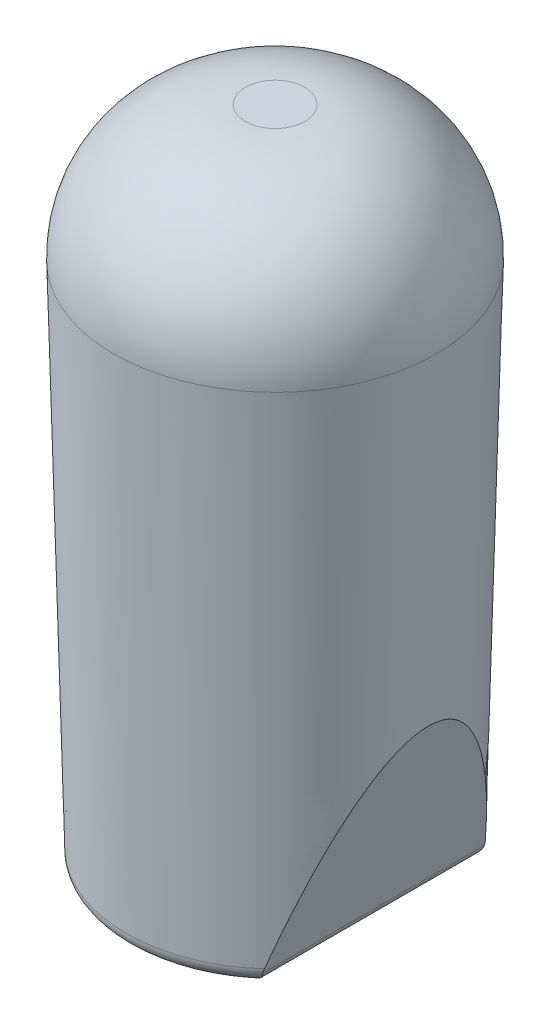
ISO-10303-21;
HEADER;
FILE_DESCRIPTION(('STEP AP214'),'2;1');
FILE_NAME('part.step','',(''),(''),'','','');
FILE_SCHEMA(('AUTOMOTIVE_DESIGN { 1 0 10303 214 1 1 1 1 }'));
ENDSEC;
DATA;
#1=APPLICATION_CONTEXT('core data for automotive mechanical design processes');
#2=APPLICATION_PROTOCOL_DEFINITION('international standard','automotive_design',2000,#1);
#3=PRODUCT_CONTEXT('',#1,'mechanical');
#4=PRODUCT('Part','Part','',(#3));
#5=PRODUCT_RELATED_PRODUCT_CATEGORY('part','',(#4));
#6=PRODUCT_DEFINITION_FORMATION('','',#4);
#7=PRODUCT_DEFINITION_CONTEXT('part definition',#1,'design');
#8=PRODUCT_DEFINITION('design','',#6,#7);
#9=PRODUCT_DEFINITION_SHAPE('','',#8);
#10=(LENGTH_UNIT() NAMED_UNIT(*) SI_UNIT(.MILLI.,.METRE.));
#11=(NAMED_UNIT(*) PLANE_ANGLE_UNIT() SI_UNIT($,.RADIAN.));
#12=(NAMED_UNIT(*) SI_UNIT($,.STERADIAN.) SOLID_ANGLE_UNIT());
#13=UNCERTAINTY_MEASURE_WITH_UNIT(LENGTH_MEASURE(1.E-05),#10,'distance_accuracy_value','');
#14=(GEOMETRIC_REPRESENTATION_CONTEXT(3) GLOBAL_UNCERTAINTY_ASSIGNED_CONTEXT((#13)) GLOBAL_UNIT_ASSIGNED_CONTEXT((#10,
#11,#12)) REPRESENTATION_CONTEXT('',''));
#15=CARTESIAN_POINT('',(0.,0.,0.));
#16=DIRECTION('',(0.,0.,1.));
#17=DIRECTION('',(1.,0.,0.));
#18=AXIS2_PLACEMENT_3D('',#15,#16,#17);
#19=CARTESIAN_POINT('',(9.,0.,0.));
#20=DIRECTION('',(0.,-1.,0.));
#21=DIRECTION('',(0.,0.,1.));
#22=AXIS2_PLACEMENT_3D('',#19,#20,#21);
#23=PLANE('',#22);
#24=DIRECTION('',(0.,0.,1.));
#25=VECTOR('',#24,1.);
#26=CARTESIAN_POINT('',(-2.38,0.,-7.));
#27=LINE('',#26,#25);
#28=CARTESIAN_POINT('',(-2.38,0.,-7.));
#29=VERTEX_POINT('',#28);
#30=CARTESIAN_POINT('',(-2.38,0.,7.));
#31=VERTEX_POINT('',#30);
#32=EDGE_CURVE('E147',#29,#31,#27,.T.);
#33=ORIENTED_EDGE('',*,*,#32,.T.);
#34=DIRECTION('',(1.,0.,0.));
#35=VECTOR('',#34,1.);
#36=CARTESIAN_POINT('',(2.38,0.,7.));
#37=LINE('',#36,#35);
#38=CARTESIAN_POINT('',(2.38,0.,7.));
#39=VERTEX_POINT('',#38);
#40=EDGE_CURVE('E132',#31,#39,#37,.T.);
#41=ORIENTED_EDGE('',*,*,#40,.T.);
#42=DIRECTION('',(0.,0.,-1.));
#43=VECTOR('',#42,1.);
#44=CARTESIAN_POINT('',(2.38,0.,-7.));
#45=LINE('',#44,#43);
#46=CARTESIAN_POINT('',(2.38,0.,-7.));
#47=VERTEX_POINT('',#46);
#48=EDGE_CURVE('E142',#39,#47,#45,.T.);
#49=ORIENTED_EDGE('',*,*,#48,.T.);
#50=DIRECTION('',(-1.,0.,0.));
#51=VECTOR('',#50,1.);
#52=CARTESIAN_POINT('',(2.38,0.,-7.));
#53=LINE('',#52,#51);
#54=EDGE_CURVE('E139',#47,#29,#53,.T.);
#55=ORIENTED_EDGE('',*,*,#54,.T.);
#56=EDGE_LOOP('',(#33,#41,#49,#55));
#57=FACE_BOUND('',#56,.T.);
#58=DIRECTION('',(0.,0.,-1.));
#59=VECTOR('',#58,1.);
#60=CARTESIAN_POINT('',(-5.01324340538408,0.,0.));
#61=LINE('',#60,#59);
#62=CARTESIAN_POINT('',(-5.01324340538407,0.,-6.26601953511522));
#63=VERTEX_POINT('',#62);
#64=CARTESIAN_POINT('',(-5.01324340538408,0.,6.26601953511523));
#65=VERTEX_POINT('',#64);
#66=EDGE_CURVE('E172',#63,#65,#61,.F.);
#67=ORIENTED_EDGE('',*,*,#66,.F.);
#68=CARTESIAN_POINT('',(0.,0.,0.));
#69=DIRECTION('',(0.,1.,0.));
#70=DIRECTION('',(0.,0.,1.));
#71=AXIS2_PLACEMENT_3D('',#68,#69,#70);
#72=CIRCLE('',#71,8.02468754881287);
#73=CARTESIAN_POINT('',(5.01324340538407,0.,-6.26601953511522));
#74=VERTEX_POINT('',#73);
#75=EDGE_CURVE('E169',#74,#63,#72,.T.);
#76=ORIENTED_EDGE('',*,*,#75,.F.);
#77=DIRECTION('',(0.,0.,-1.));
#78=VECTOR('',#77,1.);
#79=CARTESIAN_POINT('',(5.01324340538408,0.,-6.91462258432967));
#80=LINE('',#79,#78);
#81=CARTESIAN_POINT('',(5.01324340538408,0.,6.26601953511523));
#82=VERTEX_POINT('',#81);
#83=EDGE_CURVE('E174',#82,#74,#80,.T.);
#84=ORIENTED_EDGE('',*,*,#83,.F.);
#85=CARTESIAN_POINT('',(0.,0.,0.));
#86=DIRECTION('',(0.,1.,0.));
#87=DIRECTION('',(0.,0.,1.));
#88=AXIS2_PLACEMENT_3D('',#85,#86,#87);
#89=CIRCLE('',#88,8.02468754881287);
#90=EDGE_CURVE('E177',#65,#82,#89,.T.);
#91=ORIENTED_EDGE('',*,*,#90,.F.);
#92=EDGE_LOOP('',(#67,#76,#84,#91));
#93=FACE_BOUND('',#92,.T.);
#94=ADVANCED_FACE('F35',(#57,#93),#23,.T.);
#95=CARTESIAN_POINT('',(0.,0.,0.));
#96=DIRECTION('',(0.,1.,0.));
#97=DIRECTION('',(0.,0.,-1.));
#98=AXIS2_PLACEMENT_3D('',#95,#96,#97);
#99=CONICAL_SURFACE('',#98,9.,0.0249947936189201);
#100=CARTESIAN_POINT('',(0.72673325034867,-17.0693300139473,0.));
#101=DIRECTION('',(0.959155660836636,-0.282878804941331,0.));
#102=DIRECTION('',(0.282878804941331,0.959155660836636,0.));
#103=AXIS2_PLACEMENT_3D('',#100,#101,#102);
#104=ELLIPSE('',#103,30.3072078921905,8.54240958649927);
#105=CARTESIAN_POINT('',(6.04845622784257,0.975007808839801,6.69742673897912));
#106=VERTEX_POINT('',#105);
#107=CARTESIAN_POINT('',(6.04845622784257,0.975007808839783,-6.69742673897912));
#108=VERTEX_POINT('',#107);
#109=EDGE_CURVE('E166',#106,#108,#104,.F.);
#110=ORIENTED_EDGE('',*,*,#109,.T.);
#111=CARTESIAN_POINT('',(0.,0.975007808839801,0.));
#112=DIRECTION('',(0.,1.,0.));
#113=DIRECTION('',(0.,0.,1.));
#114=AXIS2_PLACEMENT_3D('',#111,#112,#113);
#115=CIRCLE('',#114,9.024375195221);
#116=CARTESIAN_POINT('',(-6.04845622784257,0.975007808839801,-6.69742673897911));
#117=VERTEX_POINT('',#116);
#118=EDGE_CURVE('E49',#117,#108,#115,.F.);
#119=ORIENTED_EDGE('',*,*,#118,.F.);
#120=CARTESIAN_POINT('',(-0.726733250348684,-17.0693300139473,0.));
#121=DIRECTION('',(0.959155660836636,0.282878804941331,0.));
#122=DIRECTION('',(-0.282878804941331,0.959155660836636,0.));
#123=AXIS2_PLACEMENT_3D('',#120,#121,#122);
#124=ELLIPSE('',#123,30.3072078921905,8.54240958649926);
#125=CARTESIAN_POINT('',(-6.04845622784257,0.975007808839797,6.69742673897911));
#126=VERTEX_POINT('',#125);
#127=EDGE_CURVE('E163',#126,#117,#124,.F.);
#128=ORIENTED_EDGE('',*,*,#127,.F.);
#129=CARTESIAN_POINT('',(0.,0.975007808839801,0.));
#130=DIRECTION('',(0.,1.,0.));
#131=DIRECTION('',(0.,0.,1.));
#132=AXIS2_PLACEMENT_3D('',#129,#130,#131);
#133=CIRCLE('',#132,9.024375195221);
#134=EDGE_CURVE('E11',#106,#126,#133,.F.);
#135=ORIENTED_EDGE('',*,*,#134,.F.);
#136=EDGE_LOOP('',(#110,#119,#128,#135));
#137=FACE_BOUND('',#136,.T.);
#138=CARTESIAN_POINT('',(0.,31.8000624707184,0.));
#139=DIRECTION('',(0.,1.,0.));
#140=DIRECTION('',(0.,0.,1.));
#141=AXIS2_PLACEMENT_3D('',#138,#139,#140);
#142=CIRCLE('',#141,9.79500156176796);
#143=CARTESIAN_POINT('',(0.,31.8000624707184,9.79500156176796));
#144=VERTEX_POINT('',#143);
#145=EDGE_CURVE('E157',#144,#144,#142,.T.);
#146=ORIENTED_EDGE('',*,*,#145,.F.);
#147=EDGE_LOOP('',(#146));
#148=FACE_BOUND('',#147,.T.);
#149=ADVANCED_FACE('F248',(#137,#148),#99,.T.);
#150=CARTESIAN_POINT('',(0.,40.,0.));
#151=DIRECTION('',(0.,1.,0.));
#152=DIRECTION('',(0.,0.,-1.));
#153=AXIS2_PLACEMENT_3D('',#150,#151,#152);
#154=PLANE('',#153);
#155=CARTESIAN_POINT('',(0.,40.,0.));
#156=DIRECTION('',(0.,-1.,0.));
#157=DIRECTION('',(0.,0.,-1.));
#158=AXIS2_PLACEMENT_3D('',#155,#156,#157);
#159=CIRCLE('',#158,1.79750039050298);
#160=CARTESIAN_POINT('',(0.,40.,-1.79750039050298));
#161=VERTEX_POINT('',#160);
#162=EDGE_CURVE('E160',#161,#161,#159,.T.);
#163=ORIENTED_EDGE('',*,*,#162,.F.);
#164=EDGE_LOOP('',(#163));
#165=FACE_BOUND('',#164,.T.);
#166=ADVANCED_FACE('F283',(#165),#154,.T.);
#167=CARTESIAN_POINT('',(0.,32.,0.));
#168=DIRECTION('',(0.,1.,0.));
#169=DIRECTION('',(0.,0.,-1.));
#170=AXIS2_PLACEMENT_3D('',#167,#168,#169);
#171=DEGENERATE_TOROIDAL_SURFACE('',#170,1.79750039050298,8.,.T.);
#172=ORIENTED_EDGE('',*,*,#162,.T.);
#173=EDGE_LOOP('',(#172));
#174=FACE_BOUND('',#173,.T.);
#175=ORIENTED_EDGE('',*,*,#145,.T.);
#176=EDGE_LOOP('',(#175));
#177=FACE_BOUND('',#176,.T.);
#178=ADVANCED_FACE('F261',(#174,#177),#171,.T.);
#179=CARTESIAN_POINT('',(-9.3,12.,72.0767019800829));
#180=DIRECTION('',(-0.959155660836636,-0.282878804941331,0.));
#181=DIRECTION('',(0.282878804941331,-0.959155660836636,0.));
#182=AXIS2_PLACEMENT_3D('',#179,#180,#181);
#183=PLANE('',#182);
#184=ORIENTED_EDGE('',*,*,#127,.T.);
#185=CARTESIAN_POINT('',(-5.97239906622071,0.71712119505867,-6.71117636553917));
#186=CARTESIAN_POINT('',(-5.97875164745178,0.73866085848437,-6.71403238115715));
#187=CARTESIAN_POINT('',(-5.98514013425925,0.760322266757219,-6.71583606493878));
#188=CARTESIAN_POINT('',(-5.99788974646451,0.803552309116433,-6.71739895712802));
#189=CARTESIAN_POINT('',(-6.00425072149561,0.825120433355341,-6.71717328582126));
#190=CARTESIAN_POINT('',(-6.01694133906215,0.868150442906553,-6.71477828334975));
#191=CARTESIAN_POINT('',(-6.02327098596146,0.889612343015406,-6.71260923101547));
#192=CARTESIAN_POINT('',(-6.03590546793278,0.932452013902179,-6.70640596599612));
#193=CARTESIAN_POINT('',(-6.04220976078654,0.953827946183526,-6.70235788528758));
#194=CARTESIAN_POINT('',(-6.0484562278426,0.9750078088399,-6.69742673897909));
#195=B_SPLINE_CURVE_WITH_KNOTS('',3,(#185,#186,#187,#188,#189,#190,#191,#192,#193,#194),
.UNSPECIFIED.,.F.,.F.,(4,2,2,2,4),(0.,0.0678790607278224,0.135252790744318,0.202616855727603,
0.270486200087882),.UNSPECIFIED.);
#196=CARTESIAN_POINT('',(-5.97239906622071,0.71712119505867,-6.71117636553917));
#197=VERTEX_POINT('',#196);
#198=EDGE_CURVE('E239',#197,#117,#195,.T.);
#199=ORIENTED_EDGE('',*,*,#198,.F.);
#200=DIRECTION('',(0.,0.,-1.));
#201=VECTOR('',#200,1.);
#202=CARTESIAN_POINT('',(-5.97239906622071,0.71712119505867,72.0767019800829));
#203=LINE('',#202,#201);
#204=CARTESIAN_POINT('',(-5.97239906622071,0.71712119505867,6.71117636553917));
#205=VERTEX_POINT('',#204);
#206=EDGE_CURVE('E237',#205,#197,#203,.T.);
#207=ORIENTED_EDGE('',*,*,#206,.F.);
#208=CARTESIAN_POINT('',(-6.04845622784257,0.975007808839797,6.69742673897911));
#209=CARTESIAN_POINT('',(-6.04220976078651,0.953827946183432,6.70235788528759));
#210=CARTESIAN_POINT('',(-6.03590546793275,0.932452013902093,6.70640596599613));
#211=CARTESIAN_POINT('',(-6.02327098596144,0.889612343015337,6.71260923101548));
#212=CARTESIAN_POINT('',(-6.01694133906214,0.868150442906492,6.71477828334975));
#213=CARTESIAN_POINT('',(-6.0042507214956,0.825120433355298,6.71717328582127));
#214=CARTESIAN_POINT('',(-5.99788974646449,0.803552309116398,6.71739895712802));
#215=CARTESIAN_POINT('',(-5.98514013425925,0.760322266757202,6.71583606493878));
#216=CARTESIAN_POINT('',(-5.97875164745178,0.738660858484362,6.71403238115715));
#217=CARTESIAN_POINT('',(-5.97239906622071,0.717121195058671,6.71117636553917));
#218=B_SPLINE_CURVE_WITH_KNOTS('',3,(#208,#209,#210,#211,#212,#213,#214,#215,#216,#217),
.UNSPECIFIED.,.F.,.F.,(4,2,2,2,4),(0.,0.0678693443602504,0.135233409343509,0.202607139359977,
0.270486200087772),.UNSPECIFIED.);
#219=EDGE_CURVE('E245',#126,#205,#218,.T.);
#220=ORIENTED_EDGE('',*,*,#219,.F.);
#221=EDGE_LOOP('',(#184,#199,#207,#220));
#222=FACE_BOUND('',#221,.T.);
#223=ADVANCED_FACE('F244',(#222),#183,.T.);
#224=CARTESIAN_POINT('',(9.3,12.,69.469980210495));
#225=DIRECTION('',(-0.959155660836636,0.282878804941331,0.));
#226=DIRECTION('',(-0.282878804941331,-0.959155660836636,0.));
#227=AXIS2_PLACEMENT_3D('',#224,#225,#226);
#228=PLANE('',#227);
#229=DIRECTION('',(0.,0.,-1.));
#230=VECTOR('',#229,1.);
#231=CARTESIAN_POINT('',(5.97239906622071,0.717121195058669,6.91462258432967));
#232=LINE('',#231,#230);
#233=CARTESIAN_POINT('',(5.97239906622071,0.717121195058669,-6.71117636553917));
#234=VERTEX_POINT('',#233);
#235=CARTESIAN_POINT('',(5.97239906622071,0.717121195058669,6.71117636553917));
#236=VERTEX_POINT('',#235);
#237=EDGE_CURVE('E189',#234,#236,#232,.F.);
#238=ORIENTED_EDGE('',*,*,#237,.F.);
#239=CARTESIAN_POINT('',(6.04845622784257,0.975007808839797,-6.69742673897911));
#240=CARTESIAN_POINT('',(6.04220976078651,0.953827946183431,-6.7023578852876));
#241=CARTESIAN_POINT('',(6.03590546793275,0.932452013902092,-6.70640596599614));
#242=CARTESIAN_POINT('',(6.02327098596144,0.889612343015336,-6.71260923101548));
#243=CARTESIAN_POINT('',(6.01694133906214,0.868150442906491,-6.71477828334975));
#244=CARTESIAN_POINT('',(6.0042507214956,0.825120433355296,-6.71717328582127));
#245=CARTESIAN_POINT('',(5.99788974646449,0.803552309116396,-6.71739895712802));
#246=CARTESIAN_POINT('',(5.98514013425925,0.760322266757201,-6.71583606493878));
#247=CARTESIAN_POINT('',(5.97875164745178,0.73866085848436,-6.71403238115715));
#248=CARTESIAN_POINT('',(5.97239906622071,0.717121195058669,-6.71117636553917));
#249=B_SPLINE_CURVE_WITH_KNOTS('',3,(#239,#240,#241,#242,#243,#244,#245,#246,#247,#248),
.UNSPECIFIED.,.F.,.F.,(4,2,2,2,4),(0.,0.06786934436025,0.135233409343509,0.202607139359977,
0.270486200087772),.UNSPECIFIED.);
#250=EDGE_CURVE('E180',#108,#234,#249,.T.);
#251=ORIENTED_EDGE('',*,*,#250,.F.);
#252=ORIENTED_EDGE('',*,*,#109,.F.);
#253=CARTESIAN_POINT('',(5.97239906622071,0.717121195058669,6.71117636553917));
#254=CARTESIAN_POINT('',(5.97875164745178,0.73866085848436,6.71403238115715));
#255=CARTESIAN_POINT('',(5.98514013425925,0.7603222667572,6.71583606493878));
#256=CARTESIAN_POINT('',(5.99788974646449,0.803552309116396,6.71739895712802));
#257=CARTESIAN_POINT('',(6.0042507214956,0.825120433355296,6.71717328582127));
#258=CARTESIAN_POINT('',(6.01694133906214,0.868150442906491,6.71477828334975));
#259=CARTESIAN_POINT('',(6.02327098596144,0.889612343015336,6.71260923101548));
#260=CARTESIAN_POINT('',(6.03590546793275,0.932452013902092,6.70640596599614));
#261=CARTESIAN_POINT('',(6.04220976078651,0.953827946183431,6.7023578852876));
#262=CARTESIAN_POINT('',(6.04845622784257,0.975007808839796,6.69742673897911));
#263=B_SPLINE_CURVE_WITH_KNOTS('',3,(#253,#254,#255,#256,#257,#258,#259,#260,#261,#262),
.UNSPECIFIED.,.F.,.F.,(4,2,2,2,4),(0.,0.0678790607277951,0.135252790744263,0.202616855727522,
0.270486200087772),.UNSPECIFIED.);
#264=EDGE_CURVE('E242',#236,#106,#263,.T.);
#265=ORIENTED_EDGE('',*,*,#264,.F.);
#266=EDGE_LOOP('',(#238,#251,#252,#265));
#267=FACE_BOUND('',#266,.T.);
#268=ADVANCED_FACE('F191',(#267),#228,.F.);
#269=CARTESIAN_POINT('',(-5.01324340538408,0.999999999999999,72.0767019800829));
#270=DIRECTION('',(0.,0.,-1.));
#271=DIRECTION('',(1.,0.,0.));
#272=AXIS2_PLACEMENT_3D('',#269,#270,#271);
#273=CYLINDRICAL_SURFACE('',#272,1.);
#274=CARTESIAN_POINT('',(-5.97239906622071,0.717121195058668,-6.71117636553917));
#275=CARTESIAN_POINT('',(-5.964597802691,0.690666174343034,-6.70767563511496));
#276=CARTESIAN_POINT('',(-5.95572174374482,0.664609644277068,-6.70369017099201));
#277=CARTESIAN_POINT('',(-5.93592455640818,0.613462326676844,-6.69479100193588));
#278=CARTESIAN_POINT('',(-5.92500432807718,0.5883711199445,-6.68987770552421));
#279=CARTESIAN_POINT('',(-5.88943366585486,0.514993759894755,-6.67385276022762));
#280=CARTESIAN_POINT('',(-5.86189825824856,0.46835332389664,-6.66142250695135));
#281=CARTESIAN_POINT('',(-5.80029769639917,0.380796735284814,-6.63351600914163));
#282=CARTESIAN_POINT('',(-5.76624132753651,0.339873007684555,-6.61804386206394));
#283=CARTESIAN_POINT('',(-5.6927179840039,0.264411213276677,-6.58450312536579));
#284=CARTESIAN_POINT('',(-5.65324684864317,0.229878105403639,-6.56643253859226));
#285=CARTESIAN_POINT('',(-5.56757303340255,0.165884217415277,-6.52702666320147));
#286=CARTESIAN_POINT('',(-5.52110734651739,0.136857769725877,-6.50555988011003));
#287=CARTESIAN_POINT('',(-5.42476550227872,0.0869864616719437,-6.46080900471711));
#288=CARTESIAN_POINT('',(-5.37488740979032,0.0661462895678663,-6.43752388017939));
#289=CARTESIAN_POINT('',(-5.27448875851816,0.0333245473173011,-6.39038279769287));
#290=CARTESIAN_POINT('',(-5.22402836329687,0.0211045050008467,-6.36656275087413));
#291=CARTESIAN_POINT('',(-5.12224088152588,0.0046262075999059,-6.31823251812219));
#292=CARTESIAN_POINT('',(-5.07091579525187,0.00035159751159655,-6.29372385551423));
#293=CARTESIAN_POINT('',(-5.01754403842603,6.92076652850028E-06,-6.26808616240055));
#294=CARTESIAN_POINT('',(-5.01539360853196,-1.54334389489813E-08,-6.26705292325662));
#295=CARTESIAN_POINT('',(-5.0132434053841,0.,-6.26601953511524));
#296=B_SPLINE_CURVE_WITH_KNOTS('',3,(#274,#275,#276,#277,#278,#279,#280,#281,#282,#283,#284,
#285,#286,#287,#288,#289,#290,#291,#292,#293,#294,#295),.UNSPECIFIED.,.F.,.F.,(4,2,2,2,2,2,2,2,
2,2,4),(0.,0.0833490158413959,0.166661418590738,0.332505985276801,0.498128669906504,
0.66387933889825,0.839676850173068,1.01557489398826,1.1863925982709,1.35685829762305,
1.36401561090144),.UNSPECIFIED.);
#297=EDGE_CURVE('E215',#197,#63,#296,.T.);
#298=ORIENTED_EDGE('',*,*,#297,.T.);
#299=ORIENTED_EDGE('',*,*,#66,.T.);
#300=CARTESIAN_POINT('',(-5.97239906622071,0.717121195058668,6.71117636553917));
#301=CARTESIAN_POINT('',(-5.964597802691,0.690666174343035,6.70767563511496));
#302=CARTESIAN_POINT('',(-5.95572174374482,0.664609644277069,6.70369017099201));
#303=CARTESIAN_POINT('',(-5.93592455640818,0.613462326676845,6.69479100193589));
#304=CARTESIAN_POINT('',(-5.92500432807718,0.588371119944501,6.68987770552421));
#305=CARTESIAN_POINT('',(-5.88943366585486,0.514993759894756,6.67385276022762));
#306=CARTESIAN_POINT('',(-5.86189825824856,0.468353323896642,6.66142250695135));
#307=CARTESIAN_POINT('',(-5.80029769639917,0.380796735284816,6.63351600914163));
#308=CARTESIAN_POINT('',(-5.76624132753651,0.339873007684557,6.61804386206394));
#309=CARTESIAN_POINT('',(-5.6927179840039,0.264411213276679,6.58450312536579));
#310=CARTESIAN_POINT('',(-5.65324684864318,0.229878105403641,6.56643253859226));
#311=CARTESIAN_POINT('',(-5.56757303340255,0.16588421741528,6.52702666320147));
#312=CARTESIAN_POINT('',(-5.52110734651739,0.13685776972588,6.50555988011003));
#313=CARTESIAN_POINT('',(-5.42476550227872,0.0869864616719463,6.46080900471711));
#314=CARTESIAN_POINT('',(-5.37488740979032,0.0661462895678689,6.43752388017939));
#315=CARTESIAN_POINT('',(-5.27448875851815,0.0333245473172997,6.39038279769287));
#316=CARTESIAN_POINT('',(-5.22402836329685,0.0211045050008431,6.36656275087412));
#317=CARTESIAN_POINT('',(-5.12224088152585,0.00462620759990119,6.31823251812217));
#318=CARTESIAN_POINT('',(-5.07091579525183,0.000351597511593099,6.2937238555142));
#319=CARTESIAN_POINT('',(-5.01754403842599,6.92076652823866E-06,6.26808616240049));
#320=CARTESIAN_POINT('',(-5.01539360853192,-1.54334390790782E-08,6.26705292325657));
#321=CARTESIAN_POINT('',(-5.01324340538406,0.,6.26601953511518));
#322=B_SPLINE_CURVE_WITH_KNOTS('',3,(#300,#301,#302,#303,#304,#305,#306,#307,#308,#309,#310,
#311,#312,#313,#314,#315,#316,#317,#318,#319,#320,#321),.UNSPECIFIED.,.F.,.F.,(4,2,2,2,2,2,2,2,
2,2,4),(0.,0.0833490158413951,0.166661418590737,0.332505985276799,0.498128669906501,
0.663879338898245,0.839676850173063,1.01557489398825,1.18639259827093,1.35685829762311,
1.3640156109015),.UNSPECIFIED.);
#323=EDGE_CURVE('E40',#65,#205,#322,.F.);
#324=ORIENTED_EDGE('',*,*,#323,.T.);
#325=ORIENTED_EDGE('',*,*,#206,.T.);
#326=EDGE_LOOP('',(#298,#299,#324,#325));
#327=FACE_BOUND('',#326,.T.);
#328=ADVANCED_FACE('F37',(#327),#273,.T.);
#329=CARTESIAN_POINT('',(0.,1.,0.));
#330=DIRECTION('',(0.,-1.,0.));
#331=DIRECTION('',(0.,0.,1.));
#332=AXIS2_PLACEMENT_3D('',#329,#330,#331);
#333=TOROIDAL_SURFACE('',#332,8.02468754881287,1.);
#334=ORIENTED_EDGE('',*,*,#134,.T.);
#335=ORIENTED_EDGE('',*,*,#219,.T.);
#336=ORIENTED_EDGE('',*,*,#323,.F.);
#337=ORIENTED_EDGE('',*,*,#90,.T.);
#338=CARTESIAN_POINT('',(5.97239906622071,0.717121195058669,6.71117636553917));
#339=CARTESIAN_POINT('',(5.964597802691,0.690666174343035,6.70767563511496));
#340=CARTESIAN_POINT('',(5.95572174374482,0.66460964427707,6.70369017099201));
#341=CARTESIAN_POINT('',(5.93592455640818,0.613462326676846,6.69479100193588));
#342=CARTESIAN_POINT('',(5.92500432807718,0.588371119944502,6.68987770552421));
#343=CARTESIAN_POINT('',(5.88943366585486,0.514993759894757,6.67385276022762));
#344=CARTESIAN_POINT('',(5.86189825824856,0.468353323896642,6.66142250695135));
#345=CARTESIAN_POINT('',(5.80029769639917,0.380796735284815,6.63351600914163));
#346=CARTESIAN_POINT('',(5.76624132753651,0.339873007684554,6.61804386206394));
#347=CARTESIAN_POINT('',(5.6927179840039,0.264411213276677,6.5845031253658));
#348=CARTESIAN_POINT('',(5.65324684864317,0.229878105403639,6.56643253859226));
#349=CARTESIAN_POINT('',(5.56757303340256,0.16588421741528,6.52702666320146));
#350=CARTESIAN_POINT('',(5.52110734651741,0.13685776972588,6.50555988011));
#351=CARTESIAN_POINT('',(5.42476550227871,0.0869864616719466,6.46080900471714));
#352=CARTESIAN_POINT('',(5.37488740979027,0.0661462895678687,6.43752388017949));
#353=CARTESIAN_POINT('',(5.2744887585182,0.0333245473173003,6.39038279769278));
#354=CARTESIAN_POINT('',(5.22402836329702,0.0211045050008443,6.36656275087378));
#355=CARTESIAN_POINT('',(5.12224088152569,0.00462620759990355,6.31823251812254));
#356=CARTESIAN_POINT('',(5.07091579525122,0.000351597511595374,6.29372385551552));
#357=CARTESIAN_POINT('',(5.01754403842596,6.92076652881374E-06,6.26808616240063));
#358=CARTESIAN_POINT('',(5.01539360853192,-1.54334385750698E-08,6.26705292325665));
#359=CARTESIAN_POINT('',(5.01324340538408,0.,6.26601953511521));
#360=B_SPLINE_CURVE_WITH_KNOTS('',3,(#338,#339,#340,#341,#342,#343,#344,#345,#346,#347,#348,
#349,#350,#351,#352,#353,#354,#355,#356,#357,#358,#359),.UNSPECIFIED.,.F.,.F.,(4,2,2,2,2,2,2,2,
2,2,4),(0.,0.0833490158413951,0.166661418590737,0.3325059852768,0.498128669906506,
0.663879338898249,0.839676850173061,1.01557489398825,1.18639259827092,1.35685829762308,
1.36401561090147),.UNSPECIFIED.);
#361=EDGE_CURVE('E220',#82,#236,#360,.F.);
#362=ORIENTED_EDGE('',*,*,#361,.T.);
#363=ORIENTED_EDGE('',*,*,#264,.T.);
#364=EDGE_LOOP('',(#334,#335,#336,#337,#362,#363));
#365=FACE_BOUND('',#364,.T.);
#366=ADVANCED_FACE('F200',(#365),#333,.T.);
#367=CARTESIAN_POINT('',(0.,1.,0.));
#368=DIRECTION('',(0.,-1.,0.));
#369=DIRECTION('',(0.,0.,1.));
#370=AXIS2_PLACEMENT_3D('',#367,#368,#369);
#371=TOROIDAL_SURFACE('',#370,8.02468754881287,1.);
#372=ORIENTED_EDGE('',*,*,#297,.F.);
#373=ORIENTED_EDGE('',*,*,#198,.T.);
#374=ORIENTED_EDGE('',*,*,#118,.T.);
#375=ORIENTED_EDGE('',*,*,#250,.T.);
#376=CARTESIAN_POINT('',(5.97239906622071,0.717121195058669,-6.71117636553917));
#377=CARTESIAN_POINT('',(5.964597802691,0.690666174343035,-6.70767563511496));
#378=CARTESIAN_POINT('',(5.95572174374482,0.66460964427707,-6.70369017099201));
#379=CARTESIAN_POINT('',(5.93592455640818,0.613462326676846,-6.69479100193588));
#380=CARTESIAN_POINT('',(5.92500432807718,0.588371119944502,-6.68987770552421));
#381=CARTESIAN_POINT('',(5.88943366585486,0.514993759894757,-6.67385276022762));
#382=CARTESIAN_POINT('',(5.86189825824856,0.468353323896642,-6.66142250695135));
#383=CARTESIAN_POINT('',(5.80029769639917,0.380796735284815,-6.63351600914163));
#384=CARTESIAN_POINT('',(5.76624132753651,0.339873007684554,-6.61804386206394));
#385=CARTESIAN_POINT('',(5.6927179840039,0.264411213276677,-6.5845031253658));
#386=CARTESIAN_POINT('',(5.65324684864317,0.229878105403639,-6.56643253859226));
#387=CARTESIAN_POINT('',(5.56757303340256,0.16588421741528,-6.52702666320146));
#388=CARTESIAN_POINT('',(5.52110734651741,0.13685776972588,-6.50555988011));
#389=CARTESIAN_POINT('',(5.42476550227871,0.0869864616719466,-6.46080900471714));
#390=CARTESIAN_POINT('',(5.37488740979027,0.0661462895678687,-6.43752388017949));
#391=CARTESIAN_POINT('',(5.2744887585182,0.0333245473173003,-6.39038279769278));
#392=CARTESIAN_POINT('',(5.22402836329702,0.0211045050008443,-6.36656275087378));
#393=CARTESIAN_POINT('',(5.12224088152569,0.00462620759990355,-6.31823251812254));
#394=CARTESIAN_POINT('',(5.07091579525122,0.000351597511595374,-6.29372385551552));
#395=CARTESIAN_POINT('',(5.01754403842596,6.92076652881374E-06,-6.26808616240063));
#396=CARTESIAN_POINT('',(5.01539360853192,-1.54334385750698E-08,-6.26705292325665));
#397=CARTESIAN_POINT('',(5.01324340538408,0.,-6.26601953511521));
#398=B_SPLINE_CURVE_WITH_KNOTS('',3,(#376,#377,#378,#379,#380,#381,#382,#383,#384,#385,#386,
#387,#388,#389,#390,#391,#392,#393,#394,#395,#396,#397),.UNSPECIFIED.,.F.,.F.,(4,2,2,2,2,2,2,2,
2,2,4),(0.,0.0833490158413951,0.166661418590737,0.3325059852768,0.498128669906506,
0.663879338898249,0.839676850173061,1.01557489398825,1.18639259827092,1.35685829762308,
1.36401561090147),.UNSPECIFIED.);
#399=EDGE_CURVE('E153',#234,#74,#398,.T.);
#400=ORIENTED_EDGE('',*,*,#399,.T.);
#401=ORIENTED_EDGE('',*,*,#75,.T.);
#402=EDGE_LOOP('',(#372,#373,#374,#375,#400,#401));
#403=FACE_BOUND('',#402,.T.);
#404=ADVANCED_FACE('F195',(#403),#371,.T.);
#405=CARTESIAN_POINT('',(5.01324340538408,1.,0.));
#406=DIRECTION('',(0.,0.,1.));
#407=DIRECTION('',(-1.,0.,0.));
#408=AXIS2_PLACEMENT_3D('',#405,#406,#407);
#409=CYLINDRICAL_SURFACE('',#408,1.);
#410=ORIENTED_EDGE('',*,*,#361,.F.);
#411=ORIENTED_EDGE('',*,*,#83,.T.);
#412=ORIENTED_EDGE('',*,*,#399,.F.);
#413=ORIENTED_EDGE('',*,*,#237,.T.);
#414=EDGE_LOOP('',(#410,#411,#412,#413));
#415=FACE_BOUND('',#414,.T.);
#416=ADVANCED_FACE('F199',(#415),#409,.T.);
#417=CARTESIAN_POINT('',(-2.38,25.,-7.));
#418=DIRECTION('',(-1.,0.,0.));
#419=DIRECTION('',(0.,0.,-1.));
#420=AXIS2_PLACEMENT_3D('',#417,#418,#419);
#421=PLANE('',#420);
#422=ORIENTED_EDGE('',*,*,#32,.F.);
#423=DIRECTION('',(0.,-1.,0.));
#424=VECTOR('',#423,1.);
#425=CARTESIAN_POINT('',(-2.38,25.,-7.));
#426=LINE('',#425,#424);
#427=CARTESIAN_POINT('',(-2.38,25.,-7.));
#428=VERTEX_POINT('',#427);
#429=EDGE_CURVE('E138',#428,#29,#426,.T.);
#430=ORIENTED_EDGE('',*,*,#429,.F.);
#431=DIRECTION('',(0.,0.,1.));
#432=VECTOR('',#431,1.);
#433=CARTESIAN_POINT('',(-2.38,25.,-7.));
#434=LINE('',#433,#432);
#435=CARTESIAN_POINT('',(-2.38,25.,7.));
#436=VERTEX_POINT('',#435);
#437=EDGE_CURVE('E124',#428,#436,#434,.T.);
#438=ORIENTED_EDGE('',*,*,#437,.T.);
#439=DIRECTION('',(0.,-1.,0.));
#440=VECTOR('',#439,1.);
#441=CARTESIAN_POINT('',(-2.38,25.,7.));
#442=LINE('',#441,#440);
#443=EDGE_CURVE('E57',#436,#31,#442,.T.);
#444=ORIENTED_EDGE('',*,*,#443,.T.);
#445=EDGE_LOOP('',(#422,#430,#438,#444));
#446=FACE_BOUND('',#445,.T.);
#447=ADVANCED_FACE('F137',(#446),#421,.F.);
#448=CARTESIAN_POINT('',(2.38,25.,-7.));
#449=DIRECTION('',(0.,0.,-1.));
#450=DIRECTION('',(1.,0.,0.));
#451=AXIS2_PLACEMENT_3D('',#448,#449,#450);
#452=PLANE('',#451);
#453=ORIENTED_EDGE('',*,*,#54,.F.);
#454=DIRECTION('',(0.,-1.,0.));
#455=VECTOR('',#454,1.);
#456=CARTESIAN_POINT('',(2.38,25.,-7.));
#457=LINE('',#456,#455);
#458=CARTESIAN_POINT('',(2.38,25.,-7.));
#459=VERTEX_POINT('',#458);
#460=EDGE_CURVE('E154',#459,#47,#457,.T.);
#461=ORIENTED_EDGE('',*,*,#460,.F.);
#462=DIRECTION('',(-1.,0.,0.));
#463=VECTOR('',#462,1.);
#464=CARTESIAN_POINT('',(2.38,25.,-7.));
#465=LINE('',#464,#463);
#466=EDGE_CURVE('E135',#459,#428,#465,.T.);
#467=ORIENTED_EDGE('',*,*,#466,.T.);
#468=ORIENTED_EDGE('',*,*,#429,.T.);
#469=EDGE_LOOP('',(#453,#461,#467,#468));
#470=FACE_BOUND('',#469,.T.);
#471=ADVANCED_FACE('F350',(#470),#452,.F.);
#472=CARTESIAN_POINT('',(2.38,25.,-7.));
#473=DIRECTION('',(1.,0.,0.));
#474=DIRECTION('',(0.,0.,1.));
#475=AXIS2_PLACEMENT_3D('',#472,#473,#474);
#476=PLANE('',#475);
#477=ORIENTED_EDGE('',*,*,#48,.F.);
#478=DIRECTION('',(0.,-1.,0.));
#479=VECTOR('',#478,1.);
#480=CARTESIAN_POINT('',(2.38,25.,7.));
#481=LINE('',#480,#479);
#482=CARTESIAN_POINT('',(2.38,25.,7.));
#483=VERTEX_POINT('',#482);
#484=EDGE_CURVE('E134',#483,#39,#481,.T.);
#485=ORIENTED_EDGE('',*,*,#484,.F.);
#486=DIRECTION('',(0.,0.,-1.));
#487=VECTOR('',#486,1.);
#488=CARTESIAN_POINT('',(2.38,25.,-7.));
#489=LINE('',#488,#487);
#490=EDGE_CURVE('E126',#483,#459,#489,.T.);
#491=ORIENTED_EDGE('',*,*,#490,.T.);
#492=ORIENTED_EDGE('',*,*,#460,.T.);
#493=EDGE_LOOP('',(#477,#485,#491,#492));
#494=FACE_BOUND('',#493,.T.);
#495=ADVANCED_FACE('F357',(#494),#476,.F.);
#496=CARTESIAN_POINT('',(2.38,25.,7.));
#497=DIRECTION('',(0.,0.,1.));
#498=DIRECTION('',(-1.,0.,0.));
#499=AXIS2_PLACEMENT_3D('',#496,#497,#498);
#500=PLANE('',#499);
#501=ORIENTED_EDGE('',*,*,#40,.F.);
#502=ORIENTED_EDGE('',*,*,#443,.F.);
#503=DIRECTION('',(1.,0.,0.));
#504=VECTOR('',#503,1.);
#505=CARTESIAN_POINT('',(2.38,25.,7.));
#506=LINE('',#505,#504);
#507=EDGE_CURVE('E121',#436,#483,#506,.T.);
#508=ORIENTED_EDGE('',*,*,#507,.T.);
#509=ORIENTED_EDGE('',*,*,#484,.T.);
#510=EDGE_LOOP('',(#501,#502,#508,#509));
#511=FACE_BOUND('',#510,.T.);
#512=ADVANCED_FACE('F130',(#511),#500,.F.);
#513=CARTESIAN_POINT('',(0.,25.,0.));
#514=DIRECTION('',(0.,1.,0.));
#515=DIRECTION('',(0.,0.,-1.));
#516=AXIS2_PLACEMENT_3D('',#513,#514,#515);
#517=PLANE('',#516);
#518=ORIENTED_EDGE('',*,*,#437,.F.);
#519=ORIENTED_EDGE('',*,*,#466,.F.);
#520=ORIENTED_EDGE('',*,*,#490,.F.);
#521=ORIENTED_EDGE('',*,*,#507,.F.);
#522=EDGE_LOOP('',(#518,#519,#520,#521));
#523=FACE_BOUND('',#522,.T.);
#524=ADVANCED_FACE('F122',(#523),#517,.F.);
#525=CLOSED_SHELL('',(#94,#149,#166,#178,#223,#268,#328,#366,#404,#416,#447,#471,#495,#512,#524));
#526=MANIFOLD_SOLID_BREP('B2',#525);
#527=ADVANCED_BREP_SHAPE_REPRESENTATION('',(#18,#526),#14);
#528=SHAPE_DEFINITION_REPRESENTATION(#9,#527);
ENDSEC;
END-ISO-10303-21;
